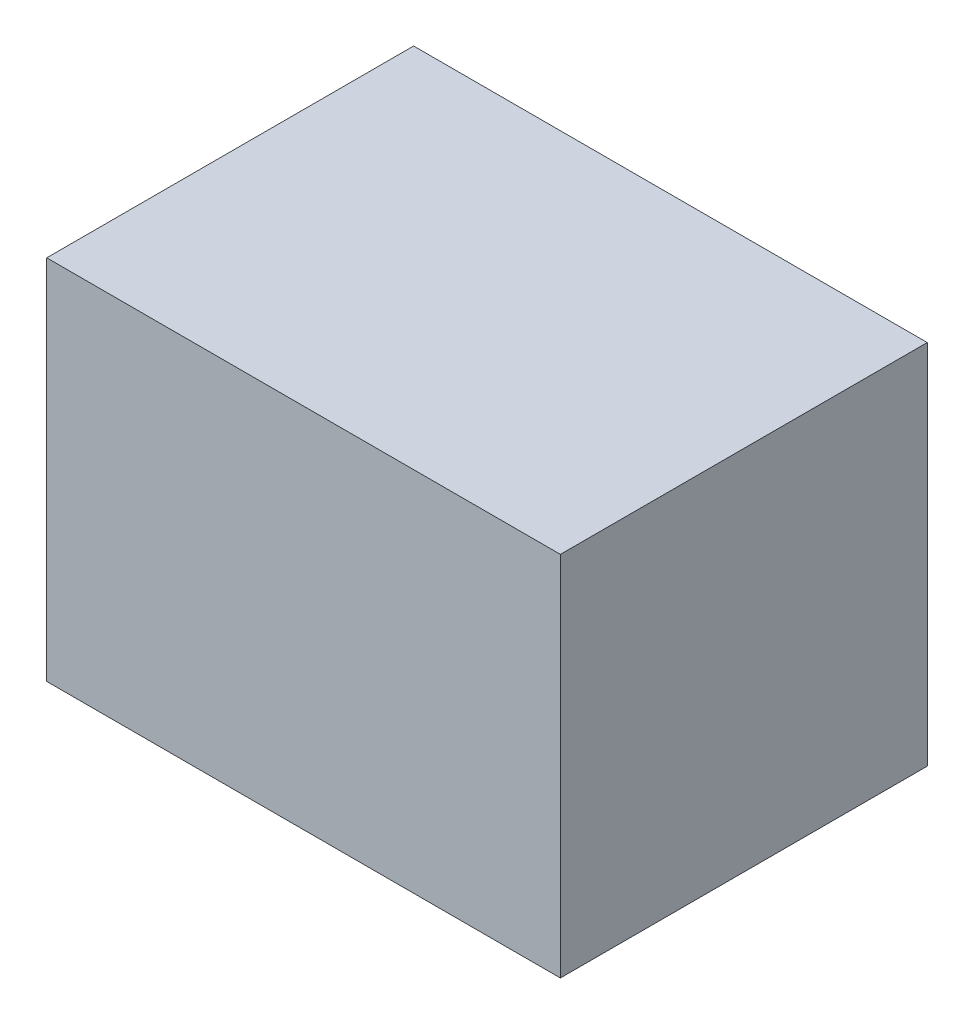
ISO-10303-21;
HEADER;
FILE_DESCRIPTION(('STEP AP214'),'2;1');
FILE_NAME('part.step','',(''),(''),'','','');
FILE_SCHEMA(('AUTOMOTIVE_DESIGN { 1 0 10303 214 1 1 1 1 }'));
ENDSEC;
DATA;
#1=APPLICATION_CONTEXT('core data for automotive mechanical design processes');
#2=APPLICATION_PROTOCOL_DEFINITION('international standard','automotive_design',2000,#1);
#3=PRODUCT_CONTEXT('',#1,'mechanical');
#4=PRODUCT('Part','Part','',(#3));
#5=PRODUCT_RELATED_PRODUCT_CATEGORY('part','',(#4));
#6=PRODUCT_DEFINITION_FORMATION('','',#4);
#7=PRODUCT_DEFINITION_CONTEXT('part definition',#1,'design');
#8=PRODUCT_DEFINITION('design','',#6,#7);
#9=PRODUCT_DEFINITION_SHAPE('','',#8);
#10=(LENGTH_UNIT() NAMED_UNIT(*) SI_UNIT(.MILLI.,.METRE.));
#11=(NAMED_UNIT(*) PLANE_ANGLE_UNIT() SI_UNIT($,.RADIAN.));
#12=(NAMED_UNIT(*) SI_UNIT($,.STERADIAN.) SOLID_ANGLE_UNIT());
#13=UNCERTAINTY_MEASURE_WITH_UNIT(LENGTH_MEASURE(1.E-05),#10,'distance_accuracy_value','');
#14=(GEOMETRIC_REPRESENTATION_CONTEXT(3) GLOBAL_UNCERTAINTY_ASSIGNED_CONTEXT((#13)) GLOBAL_UNIT_ASSIGNED_CONTEXT((#10,
#11,#12)) REPRESENTATION_CONTEXT('',''));
#15=CARTESIAN_POINT('',(0.,0.,0.));
#16=DIRECTION('',(0.,0.,1.));
#17=DIRECTION('',(1.,0.,0.));
#18=AXIS2_PLACEMENT_3D('',#15,#16,#17);
#19=CARTESIAN_POINT('',(0.,-31.75,-31.75));
#20=DIRECTION('',(1.,0.,0.));
#21=DIRECTION('',(0.,0.,-1.));
#22=AXIS2_PLACEMENT_3D('',#19,#20,#21);
#23=PLANE('',#22);
#24=DIRECTION('',(0.,1.,0.));
#25=VECTOR('',#24,1.);
#26=CARTESIAN_POINT('',(0.,31.75,-31.75));
#27=LINE('',#26,#25);
#28=CARTESIAN_POINT('',(0.,-31.75,-31.75));
#29=VERTEX_POINT('',#28);
#30=CARTESIAN_POINT('',(0.,31.75,-31.75));
#31=VERTEX_POINT('',#30);
#32=EDGE_CURVE('E84',#29,#31,#27,.T.);
#33=ORIENTED_EDGE('',*,*,#32,.F.);
#34=DIRECTION('',(0.,0.,-1.));
#35=VECTOR('',#34,1.);
#36=CARTESIAN_POINT('',(0.,-31.75,31.75));
#37=LINE('',#36,#35);
#38=CARTESIAN_POINT('',(0.,-31.75,31.75));
#39=VERTEX_POINT('',#38);
#40=EDGE_CURVE('E57',#39,#29,#37,.T.);
#41=ORIENTED_EDGE('',*,*,#40,.F.);
#42=DIRECTION('',(0.,-1.,0.));
#43=VECTOR('',#42,1.);
#44=CARTESIAN_POINT('',(0.,31.75,31.75));
#45=LINE('',#44,#43);
#46=CARTESIAN_POINT('',(0.,31.75,31.75));
#47=VERTEX_POINT('',#46);
#48=EDGE_CURVE('E51',#47,#39,#45,.T.);
#49=ORIENTED_EDGE('',*,*,#48,.F.);
#50=DIRECTION('',(0.,0.,1.));
#51=VECTOR('',#50,1.);
#52=CARTESIAN_POINT('',(0.,31.75,31.75));
#53=LINE('',#52,#51);
#54=EDGE_CURVE('E75',#31,#47,#53,.T.);
#55=ORIENTED_EDGE('',*,*,#54,.F.);
#56=EDGE_LOOP('',(#33,#41,#49,#55));
#57=FACE_BOUND('',#56,.T.);
#58=CARTESIAN_POINT('',(0.,0.,0.));
#59=DIRECTION('',(1.,0.,0.));
#60=DIRECTION('',(0.,0.,-1.));
#61=AXIS2_PLACEMENT_3D('',#58,#59,#60);
#62=CIRCLE('',#61,3.);
#63=CARTESIAN_POINT('',(0.,0.,-3.));
#64=VERTEX_POINT('',#63);
#65=EDGE_CURVE('E11',#64,#64,#62,.F.);
#66=ORIENTED_EDGE('',*,*,#65,.F.);
#67=EDGE_LOOP('',(#66));
#68=FACE_BOUND('',#67,.T.);
#69=ADVANCED_FACE('F17',(#57,#68),#23,.F.);
#70=CARTESIAN_POINT('',(88.9,31.75,-31.75));
#71=DIRECTION('',(0.,0.,1.));
#72=DIRECTION('',(0.,-1.,0.));
#73=AXIS2_PLACEMENT_3D('',#70,#71,#72);
#74=PLANE('',#73);
#75=ORIENTED_EDGE('',*,*,#32,.T.);
#76=DIRECTION('',(-1.,0.,0.));
#77=VECTOR('',#76,1.);
#78=CARTESIAN_POINT('',(88.9,31.75,-31.75));
#79=LINE('',#78,#77);
#80=CARTESIAN_POINT('',(88.9,31.75,-31.75));
#81=VERTEX_POINT('',#80);
#82=EDGE_CURVE('E26',#81,#31,#79,.T.);
#83=ORIENTED_EDGE('',*,*,#82,.F.);
#84=DIRECTION('',(0.,1.,0.));
#85=VECTOR('',#84,1.);
#86=CARTESIAN_POINT('',(88.9,31.75,-31.75));
#87=LINE('',#86,#85);
#88=CARTESIAN_POINT('',(88.9,-31.75,-31.75));
#89=VERTEX_POINT('',#88);
#90=EDGE_CURVE('E70',#89,#81,#87,.T.);
#91=ORIENTED_EDGE('',*,*,#90,.F.);
#92=DIRECTION('',(-1.,0.,0.));
#93=VECTOR('',#92,1.);
#94=CARTESIAN_POINT('',(88.9,-31.75,-31.75));
#95=LINE('',#94,#93);
#96=EDGE_CURVE('E80',#89,#29,#95,.T.);
#97=ORIENTED_EDGE('',*,*,#96,.T.);
#98=EDGE_LOOP('',(#75,#83,#91,#97));
#99=FACE_BOUND('',#98,.T.);
#100=ADVANCED_FACE('F19',(#99),#74,.F.);
#101=CARTESIAN_POINT('',(88.9,31.75,31.75));
#102=DIRECTION('',(0.,-1.,0.));
#103=DIRECTION('',(0.,0.,-1.));
#104=AXIS2_PLACEMENT_3D('',#101,#102,#103);
#105=PLANE('',#104);
#106=ORIENTED_EDGE('',*,*,#54,.T.);
#107=DIRECTION('',(-1.,0.,0.));
#108=VECTOR('',#107,1.);
#109=CARTESIAN_POINT('',(88.9,31.75,31.75));
#110=LINE('',#109,#108);
#111=CARTESIAN_POINT('',(88.9,31.75,31.75));
#112=VERTEX_POINT('',#111);
#113=EDGE_CURVE('E73',#112,#47,#110,.T.);
#114=ORIENTED_EDGE('',*,*,#113,.F.);
#115=DIRECTION('',(0.,0.,1.));
#116=VECTOR('',#115,1.);
#117=CARTESIAN_POINT('',(88.9,31.75,31.75));
#118=LINE('',#117,#116);
#119=EDGE_CURVE('E65',#81,#112,#118,.T.);
#120=ORIENTED_EDGE('',*,*,#119,.F.);
#121=ORIENTED_EDGE('',*,*,#82,.T.);
#122=EDGE_LOOP('',(#106,#114,#120,#121));
#123=FACE_BOUND('',#122,.T.);
#124=ADVANCED_FACE('F74',(#123),#105,.F.);
#125=CARTESIAN_POINT('',(88.9,31.75,31.75));
#126=DIRECTION('',(0.,0.,-1.));
#127=DIRECTION('',(0.,1.,0.));
#128=AXIS2_PLACEMENT_3D('',#125,#126,#127);
#129=PLANE('',#128);
#130=ORIENTED_EDGE('',*,*,#48,.T.);
#131=DIRECTION('',(-1.,0.,0.));
#132=VECTOR('',#131,1.);
#133=CARTESIAN_POINT('',(88.9,-31.75,31.75));
#134=LINE('',#133,#132);
#135=CARTESIAN_POINT('',(88.9,-31.75,31.75));
#136=VERTEX_POINT('',#135);
#137=EDGE_CURVE('E76',#136,#39,#134,.T.);
#138=ORIENTED_EDGE('',*,*,#137,.F.);
#139=DIRECTION('',(0.,-1.,0.));
#140=VECTOR('',#139,1.);
#141=CARTESIAN_POINT('',(88.9,31.75,31.75));
#142=LINE('',#141,#140);
#143=EDGE_CURVE('E68',#112,#136,#142,.T.);
#144=ORIENTED_EDGE('',*,*,#143,.F.);
#145=ORIENTED_EDGE('',*,*,#113,.T.);
#146=EDGE_LOOP('',(#130,#138,#144,#145));
#147=FACE_BOUND('',#146,.T.);
#148=ADVANCED_FACE('F78',(#147),#129,.F.);
#149=CARTESIAN_POINT('',(88.9,-31.75,31.75));
#150=DIRECTION('',(0.,1.,0.));
#151=DIRECTION('',(0.,0.,1.));
#152=AXIS2_PLACEMENT_3D('',#149,#150,#151);
#153=PLANE('',#152);
#154=ORIENTED_EDGE('',*,*,#40,.T.);
#155=ORIENTED_EDGE('',*,*,#96,.F.);
#156=DIRECTION('',(0.,0.,-1.));
#157=VECTOR('',#156,1.);
#158=CARTESIAN_POINT('',(88.9,-31.75,31.75));
#159=LINE('',#158,#157);
#160=EDGE_CURVE('E34',#136,#89,#159,.T.);
#161=ORIENTED_EDGE('',*,*,#160,.F.);
#162=ORIENTED_EDGE('',*,*,#137,.T.);
#163=EDGE_LOOP('',(#154,#155,#161,#162));
#164=FACE_BOUND('',#163,.T.);
#165=ADVANCED_FACE('F113',(#164),#153,.F.);
#166=CARTESIAN_POINT('',(88.9,-31.75,-31.75));
#167=DIRECTION('',(1.,0.,0.));
#168=DIRECTION('',(0.,0.,-1.));
#169=AXIS2_PLACEMENT_3D('',#166,#167,#168);
#170=PLANE('',#169);
#171=ORIENTED_EDGE('',*,*,#90,.T.);
#172=ORIENTED_EDGE('',*,*,#119,.T.);
#173=ORIENTED_EDGE('',*,*,#143,.T.);
#174=ORIENTED_EDGE('',*,*,#160,.T.);
#175=EDGE_LOOP('',(#171,#172,#173,#174));
#176=FACE_BOUND('',#175,.T.);
#177=ADVANCED_FACE('F66',(#176),#170,.T.);
#178=CARTESIAN_POINT('',(-22.225,0.,0.));
#179=DIRECTION('',(1.,0.,0.));
#180=DIRECTION('',(0.,0.,-1.));
#181=AXIS2_PLACEMENT_3D('',#178,#179,#180);
#182=CYLINDRICAL_SURFACE('',#181,3.);
#183=CARTESIAN_POINT('',(-22.225,0.,0.));
#184=DIRECTION('',(-1.,0.,0.));
#185=DIRECTION('',(0.,0.,1.));
#186=AXIS2_PLACEMENT_3D('',#183,#184,#185);
#187=CIRCLE('',#186,3.);
#188=CARTESIAN_POINT('',(-22.225,0.,3.));
#189=VERTEX_POINT('',#188);
#190=EDGE_CURVE('E87',#189,#189,#187,.T.);
#191=ORIENTED_EDGE('',*,*,#190,.F.);
#192=EDGE_LOOP('',(#191));
#193=FACE_BOUND('',#192,.T.);
#194=ORIENTED_EDGE('',*,*,#65,.T.);
#195=EDGE_LOOP('',(#194));
#196=FACE_BOUND('',#195,.T.);
#197=ADVANCED_FACE('F100',(#193,#196),#182,.T.);
#198=CARTESIAN_POINT('',(-22.225,0.,0.));
#199=DIRECTION('',(-1.,0.,0.));
#200=DIRECTION('',(0.,0.,1.));
#201=AXIS2_PLACEMENT_3D('',#198,#199,#200);
#202=PLANE('',#201);
#203=ORIENTED_EDGE('',*,*,#190,.T.);
#204=EDGE_LOOP('',(#203));
#205=FACE_BOUND('',#204,.T.);
#206=ADVANCED_FACE('F102',(#205),#202,.T.);
#207=CLOSED_SHELL('',(#69,#100,#124,#148,#165,#177,#197,#206));
#208=MANIFOLD_SOLID_BREP('B1',#207);
#209=ADVANCED_BREP_SHAPE_REPRESENTATION('',(#18,#208),#14);
#210=SHAPE_DEFINITION_REPRESENTATION(#9,#209);
ENDSEC;
END-ISO-10303-21;
